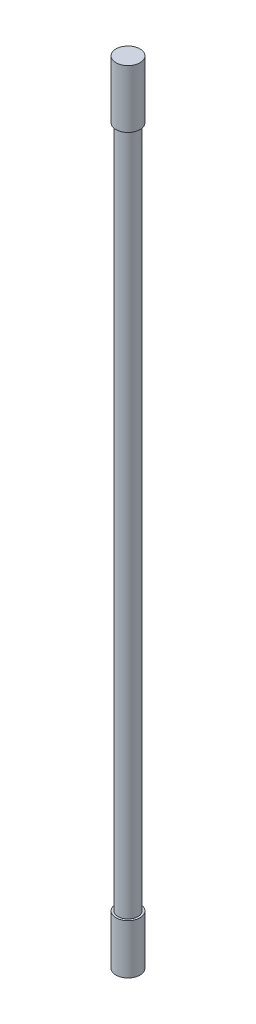
ISO-10303-21;
HEADER;
FILE_DESCRIPTION(('STEP AP214'),'2;1');
FILE_NAME('part.step','',(''),(''),'','','');
FILE_SCHEMA(('AUTOMOTIVE_DESIGN { 1 0 10303 214 1 1 1 1 }'));
ENDSEC;
DATA;
#1=APPLICATION_CONTEXT('core data for automotive mechanical design processes');
#2=APPLICATION_PROTOCOL_DEFINITION('international standard','automotive_design',2000,#1);
#3=PRODUCT_CONTEXT('',#1,'mechanical');
#4=PRODUCT('Part','Part','',(#3));
#5=PRODUCT_RELATED_PRODUCT_CATEGORY('part','',(#4));
#6=PRODUCT_DEFINITION_FORMATION('','',#4);
#7=PRODUCT_DEFINITION_CONTEXT('part definition',#1,'design');
#8=PRODUCT_DEFINITION('design','',#6,#7);
#9=PRODUCT_DEFINITION_SHAPE('','',#8);
#10=(LENGTH_UNIT() NAMED_UNIT(*) SI_UNIT(.MILLI.,.METRE.));
#11=(NAMED_UNIT(*) PLANE_ANGLE_UNIT() SI_UNIT($,.RADIAN.));
#12=(NAMED_UNIT(*) SI_UNIT($,.STERADIAN.) SOLID_ANGLE_UNIT());
#13=UNCERTAINTY_MEASURE_WITH_UNIT(LENGTH_MEASURE(1.E-05),#10,'distance_accuracy_value','');
#14=(GEOMETRIC_REPRESENTATION_CONTEXT(3) GLOBAL_UNCERTAINTY_ASSIGNED_CONTEXT((#13)) GLOBAL_UNIT_ASSIGNED_CONTEXT((#10,
#11,#12)) REPRESENTATION_CONTEXT('',''));
#15=CARTESIAN_POINT('',(0.,0.,0.));
#16=DIRECTION('',(0.,0.,1.));
#17=DIRECTION('',(1.,0.,0.));
#18=AXIS2_PLACEMENT_3D('',#15,#16,#17);
#19=CARTESIAN_POINT('',(0.,12.,0.));
#20=DIRECTION('',(0.,-1.,0.));
#21=DIRECTION('',(0.,0.,-1.));
#22=AXIS2_PLACEMENT_3D('',#19,#20,#21);
#23=CYLINDRICAL_SURFACE('',#22,2.9);
#24=CARTESIAN_POINT('',(0.,12.,0.));
#25=DIRECTION('',(0.,1.,0.));
#26=DIRECTION('',(0.,0.,1.));
#27=AXIS2_PLACEMENT_3D('',#24,#25,#26);
#28=CIRCLE('',#27,2.9);
#29=CARTESIAN_POINT('',(0.,12.,2.9));
#30=VERTEX_POINT('',#29);
#31=EDGE_CURVE('E49',#30,#30,#28,.T.);
#32=ORIENTED_EDGE('',*,*,#31,.F.);
#33=EDGE_LOOP('',(#32));
#34=FACE_BOUND('',#33,.T.);
#35=CARTESIAN_POINT('',(0.,0.,0.));
#36=DIRECTION('',(0.,1.,0.));
#37=DIRECTION('',(0.,0.,1.));
#38=AXIS2_PLACEMENT_3D('',#35,#36,#37);
#39=CIRCLE('',#38,2.9);
#40=CARTESIAN_POINT('',(0.,0.,2.9));
#41=VERTEX_POINT('',#40);
#42=EDGE_CURVE('E44',#41,#41,#39,.T.);
#43=ORIENTED_EDGE('',*,*,#42,.T.);
#44=EDGE_LOOP('',(#43));
#45=FACE_BOUND('',#44,.T.);
#46=ADVANCED_FACE('F41',(#34,#45),#23,.T.);
#47=CARTESIAN_POINT('',(0.,12.,0.));
#48=DIRECTION('',(0.,1.,0.));
#49=DIRECTION('',(0.,0.,1.));
#50=AXIS2_PLACEMENT_3D('',#47,#48,#49);
#51=PLANE('',#50);
#52=CARTESIAN_POINT('',(0.,12.,0.));
#53=DIRECTION('',(0.,1.,0.));
#54=DIRECTION('',(0.,0.,1.));
#55=AXIS2_PLACEMENT_3D('',#52,#53,#54);
#56=CIRCLE('',#55,2.4);
#57=CARTESIAN_POINT('',(0.,12.,2.4));
#58=VERTEX_POINT('',#57);
#59=EDGE_CURVE('E10',#58,#58,#56,.T.);
#60=ORIENTED_EDGE('',*,*,#59,.F.);
#61=EDGE_LOOP('',(#60));
#62=FACE_BOUND('',#61,.T.);
#63=ORIENTED_EDGE('',*,*,#31,.T.);
#64=EDGE_LOOP('',(#63));
#65=FACE_BOUND('',#64,.T.);
#66=ADVANCED_FACE('F87',(#62,#65),#51,.T.);
#67=CARTESIAN_POINT('',(0.,0.,0.));
#68=DIRECTION('',(0.,1.,0.));
#69=DIRECTION('',(0.,0.,1.));
#70=AXIS2_PLACEMENT_3D('',#67,#68,#69);
#71=PLANE('',#70);
#72=ORIENTED_EDGE('',*,*,#42,.F.);
#73=EDGE_LOOP('',(#72));
#74=FACE_BOUND('',#73,.T.);
#75=ADVANCED_FACE('F92',(#74),#71,.F.);
#76=CARTESIAN_POINT('',(0.,177.,0.));
#77=DIRECTION('',(0.,-1.,0.));
#78=DIRECTION('',(0.,0.,-1.));
#79=AXIS2_PLACEMENT_3D('',#76,#77,#78);
#80=CYLINDRICAL_SURFACE('',#79,2.4);
#81=CARTESIAN_POINT('',(0.,177.,0.));
#82=DIRECTION('',(0.,1.,0.));
#83=DIRECTION('',(0.,0.,1.));
#84=AXIS2_PLACEMENT_3D('',#81,#82,#83);
#85=CIRCLE('',#84,2.4);
#86=CARTESIAN_POINT('',(0.,177.,2.4));
#87=VERTEX_POINT('',#86);
#88=EDGE_CURVE('E56',#87,#87,#85,.T.);
#89=ORIENTED_EDGE('',*,*,#88,.F.);
#90=EDGE_LOOP('',(#89));
#91=FACE_BOUND('',#90,.T.);
#92=ORIENTED_EDGE('',*,*,#59,.T.);
#93=EDGE_LOOP('',(#92));
#94=FACE_BOUND('',#93,.T.);
#95=ADVANCED_FACE('F74',(#91,#94),#80,.T.);
#96=CARTESIAN_POINT('',(0.,191.,0.));
#97=DIRECTION('',(0.,-1.,0.));
#98=DIRECTION('',(0.,0.,-1.));
#99=AXIS2_PLACEMENT_3D('',#96,#97,#98);
#100=CYLINDRICAL_SURFACE('',#99,2.9);
#101=CARTESIAN_POINT('',(0.,191.,0.));
#102=DIRECTION('',(0.,1.,0.));
#103=DIRECTION('',(0.,0.,1.));
#104=AXIS2_PLACEMENT_3D('',#101,#102,#103);
#105=CIRCLE('',#104,2.9);
#106=CARTESIAN_POINT('',(0.,191.,2.9));
#107=VERTEX_POINT('',#106);
#108=EDGE_CURVE('E60',#107,#107,#105,.T.);
#109=ORIENTED_EDGE('',*,*,#108,.F.);
#110=EDGE_LOOP('',(#109));
#111=FACE_BOUND('',#110,.T.);
#112=CARTESIAN_POINT('',(0.,177.,0.));
#113=DIRECTION('',(0.,1.,0.));
#114=DIRECTION('',(0.,0.,1.));
#115=AXIS2_PLACEMENT_3D('',#112,#113,#114);
#116=CIRCLE('',#115,2.9);
#117=CARTESIAN_POINT('',(0.,177.,2.9));
#118=VERTEX_POINT('',#117);
#119=EDGE_CURVE('E61',#118,#118,#116,.T.);
#120=ORIENTED_EDGE('',*,*,#119,.T.);
#121=EDGE_LOOP('',(#120));
#122=FACE_BOUND('',#121,.T.);
#123=ADVANCED_FACE('F71',(#111,#122),#100,.T.);
#124=CARTESIAN_POINT('',(0.,191.,0.));
#125=DIRECTION('',(0.,1.,0.));
#126=DIRECTION('',(0.,0.,1.));
#127=AXIS2_PLACEMENT_3D('',#124,#125,#126);
#128=PLANE('',#127);
#129=ORIENTED_EDGE('',*,*,#108,.T.);
#130=EDGE_LOOP('',(#129));
#131=FACE_BOUND('',#130,.T.);
#132=ADVANCED_FACE('F69',(#131),#128,.T.);
#133=CARTESIAN_POINT('',(0.,177.,0.));
#134=DIRECTION('',(0.,1.,0.));
#135=DIRECTION('',(0.,0.,1.));
#136=AXIS2_PLACEMENT_3D('',#133,#134,#135);
#137=PLANE('',#136);
#138=ORIENTED_EDGE('',*,*,#88,.T.);
#139=EDGE_LOOP('',(#138));
#140=FACE_BOUND('',#139,.T.);
#141=ORIENTED_EDGE('',*,*,#119,.F.);
#142=EDGE_LOOP('',(#141));
#143=FACE_BOUND('',#142,.T.);
#144=ADVANCED_FACE('F78',(#140,#143),#137,.F.);
#145=CLOSED_SHELL('',(#46,#66,#75,#95,#123,#132,#144));
#146=MANIFOLD_SOLID_BREP('B2',#145);
#147=ADVANCED_BREP_SHAPE_REPRESENTATION('',(#18,#146),#14);
#148=SHAPE_DEFINITION_REPRESENTATION(#9,#147);
ENDSEC;
END-ISO-10303-21;
